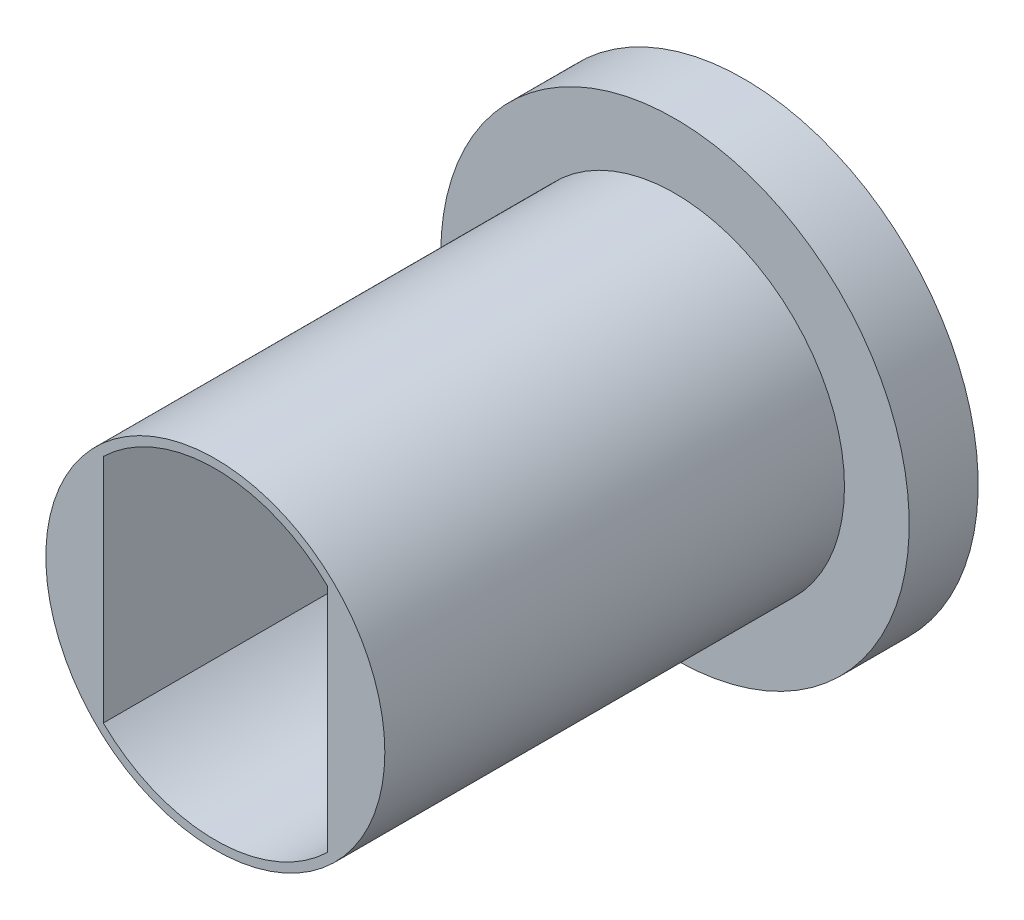
ISO-10303-21;
HEADER;
FILE_DESCRIPTION(('STEP AP214'),'2;1');
FILE_NAME('part.step','',(''),(''),'','','');
FILE_SCHEMA(('AUTOMOTIVE_DESIGN { 1 0 10303 214 1 1 1 1 }'));
ENDSEC;
DATA;
#1=APPLICATION_CONTEXT('core data for automotive mechanical design processes');
#2=APPLICATION_PROTOCOL_DEFINITION('international standard','automotive_design',2000,#1);
#3=PRODUCT_CONTEXT('',#1,'mechanical');
#4=PRODUCT('Part','Part','',(#3));
#5=PRODUCT_RELATED_PRODUCT_CATEGORY('part','',(#4));
#6=PRODUCT_DEFINITION_FORMATION('','',#4);
#7=PRODUCT_DEFINITION_CONTEXT('part definition',#1,'design');
#8=PRODUCT_DEFINITION('design','',#6,#7);
#9=PRODUCT_DEFINITION_SHAPE('','',#8);
#10=(LENGTH_UNIT() NAMED_UNIT(*) SI_UNIT(.MILLI.,.METRE.));
#11=(NAMED_UNIT(*) PLANE_ANGLE_UNIT() SI_UNIT($,.RADIAN.));
#12=(NAMED_UNIT(*) SI_UNIT($,.STERADIAN.) SOLID_ANGLE_UNIT());
#13=UNCERTAINTY_MEASURE_WITH_UNIT(LENGTH_MEASURE(1.E-05),#10,'distance_accuracy_value','');
#14=(GEOMETRIC_REPRESENTATION_CONTEXT(3) GLOBAL_UNCERTAINTY_ASSIGNED_CONTEXT((#13)) GLOBAL_UNIT_ASSIGNED_CONTEXT((#10,
#11,#12)) REPRESENTATION_CONTEXT('',''));
#15=CARTESIAN_POINT('',(0.,0.,0.));
#16=DIRECTION('',(0.,0.,1.));
#17=DIRECTION('',(1.,0.,0.));
#18=AXIS2_PLACEMENT_3D('',#15,#16,#17);
#19=CARTESIAN_POINT('',(0.,0.,8.));
#20=DIRECTION('',(0.,0.,1.));
#21=DIRECTION('',(1.,0.,0.));
#22=AXIS2_PLACEMENT_3D('',#19,#20,#21);
#23=PLANE('',#22);
#24=CARTESIAN_POINT('',(0.,0.,8.));
#25=DIRECTION('',(0.,0.,1.));
#26=DIRECTION('',(1.,0.,0.));
#27=AXIS2_PLACEMENT_3D('',#24,#25,#26);
#28=CIRCLE('',#27,2.95000000001999);
#29=CARTESIAN_POINT('',(2.95000000001999,0.,8.));
#30=VERTEX_POINT('',#29);
#31=EDGE_CURVE('E11',#30,#30,#28,.T.);
#32=ORIENTED_EDGE('',*,*,#31,.T.);
#33=EDGE_LOOP('',(#32));
#34=FACE_BOUND('',#33,.T.);
#35=DIRECTION('',(0.,1.,0.));
#36=VECTOR('',#35,1.);
#37=CARTESIAN_POINT('',(1.95000000000002,-2.009353129741,8.));
#38=LINE('',#37,#36);
#39=CARTESIAN_POINT('',(1.95000000000002,-2.009353129741,8.));
#40=VERTEX_POINT('',#39);
#41=CARTESIAN_POINT('',(1.94999999999999,2.00935312974102,8.));
#42=VERTEX_POINT('',#41);
#43=EDGE_CURVE('E105',#40,#42,#38,.T.);
#44=ORIENTED_EDGE('',*,*,#43,.F.);
#45=CARTESIAN_POINT('',(0.,0.,8.));
#46=DIRECTION('',(0.,0.,1.));
#47=DIRECTION('',(1.,0.,0.));
#48=AXIS2_PLACEMENT_3D('',#45,#46,#47);
#49=CIRCLE('',#48,2.80000000000001);
#50=CARTESIAN_POINT('',(-1.94999999999999,-2.00935312974103,8.));
#51=VERTEX_POINT('',#50);
#52=EDGE_CURVE('E85',#51,#40,#49,.T.);
#53=ORIENTED_EDGE('',*,*,#52,.F.);
#54=DIRECTION('',(0.,-1.,0.));
#55=VECTOR('',#54,1.);
#56=CARTESIAN_POINT('',(-1.94999999999999,2.00935312974101,8.));
#57=LINE('',#56,#55);
#58=CARTESIAN_POINT('',(-1.94999999999999,2.00935312974101,8.));
#59=VERTEX_POINT('',#58);
#60=EDGE_CURVE('E65',#59,#51,#57,.T.);
#61=ORIENTED_EDGE('',*,*,#60,.F.);
#62=CARTESIAN_POINT('',(0.,0.,8.));
#63=DIRECTION('',(0.,0.,1.));
#64=DIRECTION('',(1.,0.,0.));
#65=AXIS2_PLACEMENT_3D('',#62,#63,#64);
#66=CIRCLE('',#65,2.8);
#67=EDGE_CURVE('E121',#42,#59,#66,.T.);
#68=ORIENTED_EDGE('',*,*,#67,.F.);
#69=EDGE_LOOP('',(#44,#53,#61,#68));
#70=FACE_BOUND('',#69,.T.);
#71=ADVANCED_FACE('F43',(#34,#70),#23,.T.);
#72=CARTESIAN_POINT('',(0.,0.,8.));
#73=DIRECTION('',(0.,0.,-1.));
#74=DIRECTION('',(-1.,0.,0.));
#75=AXIS2_PLACEMENT_3D('',#72,#73,#74);
#76=CYLINDRICAL_SURFACE('',#75,2.95000000001999);
#77=ORIENTED_EDGE('',*,*,#31,.F.);
#78=EDGE_LOOP('',(#77));
#79=FACE_BOUND('',#78,.T.);
#80=CARTESIAN_POINT('',(0.,0.,0.));
#81=DIRECTION('',(0.,0.,1.));
#82=DIRECTION('',(1.,0.,0.));
#83=AXIS2_PLACEMENT_3D('',#80,#81,#82);
#84=CIRCLE('',#83,2.95000000001999);
#85=CARTESIAN_POINT('',(2.95000000001999,0.,0.));
#86=VERTEX_POINT('',#85);
#87=EDGE_CURVE('E47',#86,#86,#84,.T.);
#88=ORIENTED_EDGE('',*,*,#87,.T.);
#89=EDGE_LOOP('',(#88));
#90=FACE_BOUND('',#89,.T.);
#91=ADVANCED_FACE('F45',(#79,#90),#76,.T.);
#92=CARTESIAN_POINT('',(0.,0.,8.));
#93=DIRECTION('',(0.,0.,-1.));
#94=DIRECTION('',(-1.,0.,0.));
#95=AXIS2_PLACEMENT_3D('',#92,#93,#94);
#96=CYLINDRICAL_SURFACE('',#95,2.80000000000001);
#97=CARTESIAN_POINT('',(0.,0.,0.));
#98=DIRECTION('',(0.,0.,1.));
#99=DIRECTION('',(1.,0.,0.));
#100=AXIS2_PLACEMENT_3D('',#97,#98,#99);
#101=CIRCLE('',#100,2.80000000000001);
#102=CARTESIAN_POINT('',(-1.94999999999999,-2.00935312974103,0.));
#103=VERTEX_POINT('',#102);
#104=CARTESIAN_POINT('',(1.95000000000002,-2.009353129741,0.));
#105=VERTEX_POINT('',#104);
#106=EDGE_CURVE('E96',#103,#105,#101,.T.);
#107=ORIENTED_EDGE('',*,*,#106,.F.);
#108=DIRECTION('',(0.,0.,-1.));
#109=VECTOR('',#108,1.);
#110=CARTESIAN_POINT('',(-1.94999999999999,-2.00935312974103,8.));
#111=LINE('',#110,#109);
#112=EDGE_CURVE('E88',#51,#103,#111,.T.);
#113=ORIENTED_EDGE('',*,*,#112,.F.);
#114=ORIENTED_EDGE('',*,*,#52,.T.);
#115=DIRECTION('',(0.,0.,-1.));
#116=VECTOR('',#115,1.);
#117=CARTESIAN_POINT('',(1.95000000000002,-2.009353129741,8.));
#118=LINE('',#117,#116);
#119=EDGE_CURVE('E52',#40,#105,#118,.T.);
#120=ORIENTED_EDGE('',*,*,#119,.T.);
#121=EDGE_LOOP('',(#107,#113,#114,#120));
#122=FACE_BOUND('',#121,.T.);
#123=ADVANCED_FACE('F97',(#122),#96,.F.);
#124=CARTESIAN_POINT('',(1.95000000000002,-2.009353129741,8.));
#125=DIRECTION('',(-1.,0.,0.));
#126=DIRECTION('',(0.,-1.,0.));
#127=AXIS2_PLACEMENT_3D('',#124,#125,#126);
#128=PLANE('',#127);
#129=DIRECTION('',(0.,1.,0.));
#130=VECTOR('',#129,1.);
#131=CARTESIAN_POINT('',(1.95000000000002,-2.009353129741,0.));
#132=LINE('',#131,#130);
#133=CARTESIAN_POINT('',(1.94999999999999,2.00935312974102,0.));
#134=VERTEX_POINT('',#133);
#135=EDGE_CURVE('E100',#105,#134,#132,.T.);
#136=ORIENTED_EDGE('',*,*,#135,.F.);
#137=ORIENTED_EDGE('',*,*,#119,.F.);
#138=ORIENTED_EDGE('',*,*,#43,.T.);
#139=DIRECTION('',(0.,0.,-1.));
#140=VECTOR('',#139,1.);
#141=CARTESIAN_POINT('',(1.94999999999999,2.00935312974102,8.));
#142=LINE('',#141,#140);
#143=EDGE_CURVE('E111',#42,#134,#142,.T.);
#144=ORIENTED_EDGE('',*,*,#143,.T.);
#145=EDGE_LOOP('',(#136,#137,#138,#144));
#146=FACE_BOUND('',#145,.T.);
#147=ADVANCED_FACE('F115',(#146),#128,.T.);
#148=CARTESIAN_POINT('',(0.,0.,8.));
#149=DIRECTION('',(0.,0.,-1.));
#150=DIRECTION('',(-1.,0.,0.));
#151=AXIS2_PLACEMENT_3D('',#148,#149,#150);
#152=CYLINDRICAL_SURFACE('',#151,2.8);
#153=CARTESIAN_POINT('',(0.,0.,0.));
#154=DIRECTION('',(0.,0.,1.));
#155=DIRECTION('',(1.,0.,0.));
#156=AXIS2_PLACEMENT_3D('',#153,#154,#155);
#157=CIRCLE('',#156,2.8);
#158=CARTESIAN_POINT('',(-1.94999999999999,2.00935312974101,0.));
#159=VERTEX_POINT('',#158);
#160=EDGE_CURVE('E103',#134,#159,#157,.T.);
#161=ORIENTED_EDGE('',*,*,#160,.F.);
#162=ORIENTED_EDGE('',*,*,#143,.F.);
#163=ORIENTED_EDGE('',*,*,#67,.T.);
#164=DIRECTION('',(0.,0.,-1.));
#165=VECTOR('',#164,1.);
#166=CARTESIAN_POINT('',(-1.94999999999999,2.00935312974101,8.));
#167=LINE('',#166,#165);
#168=EDGE_CURVE('E59',#59,#159,#167,.T.);
#169=ORIENTED_EDGE('',*,*,#168,.T.);
#170=EDGE_LOOP('',(#161,#162,#163,#169));
#171=FACE_BOUND('',#170,.T.);
#172=ADVANCED_FACE('F118',(#171),#152,.F.);
#173=CARTESIAN_POINT('',(-1.94999999999999,2.00935312974101,8.));
#174=DIRECTION('',(1.,0.,0.));
#175=DIRECTION('',(0.,1.,0.));
#176=AXIS2_PLACEMENT_3D('',#173,#174,#175);
#177=PLANE('',#176);
#178=DIRECTION('',(0.,-1.,0.));
#179=VECTOR('',#178,1.);
#180=CARTESIAN_POINT('',(-1.94999999999999,2.00935312974101,0.));
#181=LINE('',#180,#179);
#182=EDGE_CURVE('E92',#159,#103,#181,.T.);
#183=ORIENTED_EDGE('',*,*,#182,.F.);
#184=ORIENTED_EDGE('',*,*,#168,.F.);
#185=ORIENTED_EDGE('',*,*,#60,.T.);
#186=ORIENTED_EDGE('',*,*,#112,.T.);
#187=EDGE_LOOP('',(#183,#184,#185,#186));
#188=FACE_BOUND('',#187,.T.);
#189=ADVANCED_FACE('F90',(#188),#177,.T.);
#190=CARTESIAN_POINT('',(0.,0.,0.));
#191=DIRECTION('',(0.,0.,-1.));
#192=DIRECTION('',(-1.,0.,0.));
#193=AXIS2_PLACEMENT_3D('',#190,#191,#192);
#194=PLANE('',#193);
#195=CARTESIAN_POINT('',(0.,0.,0.));
#196=DIRECTION('',(0.,0.,-1.));
#197=DIRECTION('',(-1.,0.,0.));
#198=AXIS2_PLACEMENT_3D('',#195,#196,#197);
#199=CIRCLE('',#198,1.475);
#200=CARTESIAN_POINT('',(-1.475,0.,0.));
#201=VERTEX_POINT('',#200);
#202=EDGE_CURVE('E131',#201,#201,#199,.T.);
#203=ORIENTED_EDGE('',*,*,#202,.T.);
#204=EDGE_LOOP('',(#203));
#205=FACE_BOUND('',#204,.T.);
#206=ORIENTED_EDGE('',*,*,#182,.T.);
#207=ORIENTED_EDGE('',*,*,#106,.T.);
#208=ORIENTED_EDGE('',*,*,#135,.T.);
#209=ORIENTED_EDGE('',*,*,#160,.T.);
#210=EDGE_LOOP('',(#206,#207,#208,#209));
#211=FACE_BOUND('',#210,.T.);
#212=ADVANCED_FACE('F102',(#205,#211),#194,.F.);
#213=CARTESIAN_POINT('',(0.,0.,-1.2));
#214=DIRECTION('',(0.,0.,-1.));
#215=DIRECTION('',(-1.,0.,0.));
#216=AXIS2_PLACEMENT_3D('',#213,#214,#215);
#217=PLANE('',#216);
#218=CARTESIAN_POINT('',(0.,0.,-1.2));
#219=DIRECTION('',(0.,0.,-1.));
#220=DIRECTION('',(-1.,0.,0.));
#221=AXIS2_PLACEMENT_3D('',#218,#219,#220);
#222=CIRCLE('',#221,4.07660130504639);
#223=CARTESIAN_POINT('',(-4.07660130504639,0.,-1.2));
#224=VERTEX_POINT('',#223);
#225=EDGE_CURVE('E127',#224,#224,#222,.T.);
#226=ORIENTED_EDGE('',*,*,#225,.T.);
#227=EDGE_LOOP('',(#226));
#228=FACE_BOUND('',#227,.T.);
#229=CARTESIAN_POINT('',(0.,0.,-1.2));
#230=DIRECTION('',(0.,0.,-1.));
#231=DIRECTION('',(-1.,0.,0.));
#232=AXIS2_PLACEMENT_3D('',#229,#230,#231);
#233=CIRCLE('',#232,1.475);
#234=CARTESIAN_POINT('',(-1.475,0.,-1.2));
#235=VERTEX_POINT('',#234);
#236=EDGE_CURVE('E128',#235,#235,#233,.T.);
#237=ORIENTED_EDGE('',*,*,#236,.F.);
#238=EDGE_LOOP('',(#237));
#239=FACE_BOUND('',#238,.T.);
#240=ADVANCED_FACE('F140',(#228,#239),#217,.T.);
#241=ORIENTED_EDGE('',*,*,#87,.F.);
#242=EDGE_LOOP('',(#241));
#243=FACE_BOUND('',#242,.T.);
#244=CARTESIAN_POINT('',(0.,0.,0.));
#245=DIRECTION('',(0.,0.,-1.));
#246=DIRECTION('',(-1.,0.,0.));
#247=AXIS2_PLACEMENT_3D('',#244,#245,#246);
#248=CIRCLE('',#247,4.07660130504639);
#249=CARTESIAN_POINT('',(-4.07660130504639,0.,0.));
#250=VERTEX_POINT('',#249);
#251=EDGE_CURVE('E124',#250,#250,#248,.T.);
#252=ORIENTED_EDGE('',*,*,#251,.F.);
#253=EDGE_LOOP('',(#252));
#254=FACE_BOUND('',#253,.T.);
#255=ADVANCED_FACE('F142',(#243,#254),#194,.F.);
#256=CARTESIAN_POINT('',(0.,0.,-1.2));
#257=DIRECTION('',(0.,0.,1.));
#258=DIRECTION('',(1.,0.,0.));
#259=AXIS2_PLACEMENT_3D('',#256,#257,#258);
#260=CYLINDRICAL_SURFACE('',#259,4.07660130504639);
#261=ORIENTED_EDGE('',*,*,#225,.F.);
#262=EDGE_LOOP('',(#261));
#263=FACE_BOUND('',#262,.T.);
#264=ORIENTED_EDGE('',*,*,#251,.T.);
#265=EDGE_LOOP('',(#264));
#266=FACE_BOUND('',#265,.T.);
#267=ADVANCED_FACE('F149',(#263,#266),#260,.T.);
#268=CARTESIAN_POINT('',(0.,0.,-1.2));
#269=DIRECTION('',(0.,0.,1.));
#270=DIRECTION('',(1.,0.,0.));
#271=AXIS2_PLACEMENT_3D('',#268,#269,#270);
#272=CYLINDRICAL_SURFACE('',#271,1.475);
#273=ORIENTED_EDGE('',*,*,#236,.T.);
#274=EDGE_LOOP('',(#273));
#275=FACE_BOUND('',#274,.T.);
#276=ORIENTED_EDGE('',*,*,#202,.F.);
#277=EDGE_LOOP('',(#276));
#278=FACE_BOUND('',#277,.T.);
#279=ADVANCED_FACE('F137',(#275,#278),#272,.F.);
#280=CLOSED_SHELL('',(#71,#91,#123,#147,#172,#189,#212,#240,#255,#267,#279));
#281=MANIFOLD_SOLID_BREP('B2',#280);
#282=ADVANCED_BREP_SHAPE_REPRESENTATION('',(#18,#281),#14);
#283=SHAPE_DEFINITION_REPRESENTATION(#9,#282);
ENDSEC;
END-ISO-10303-21;
